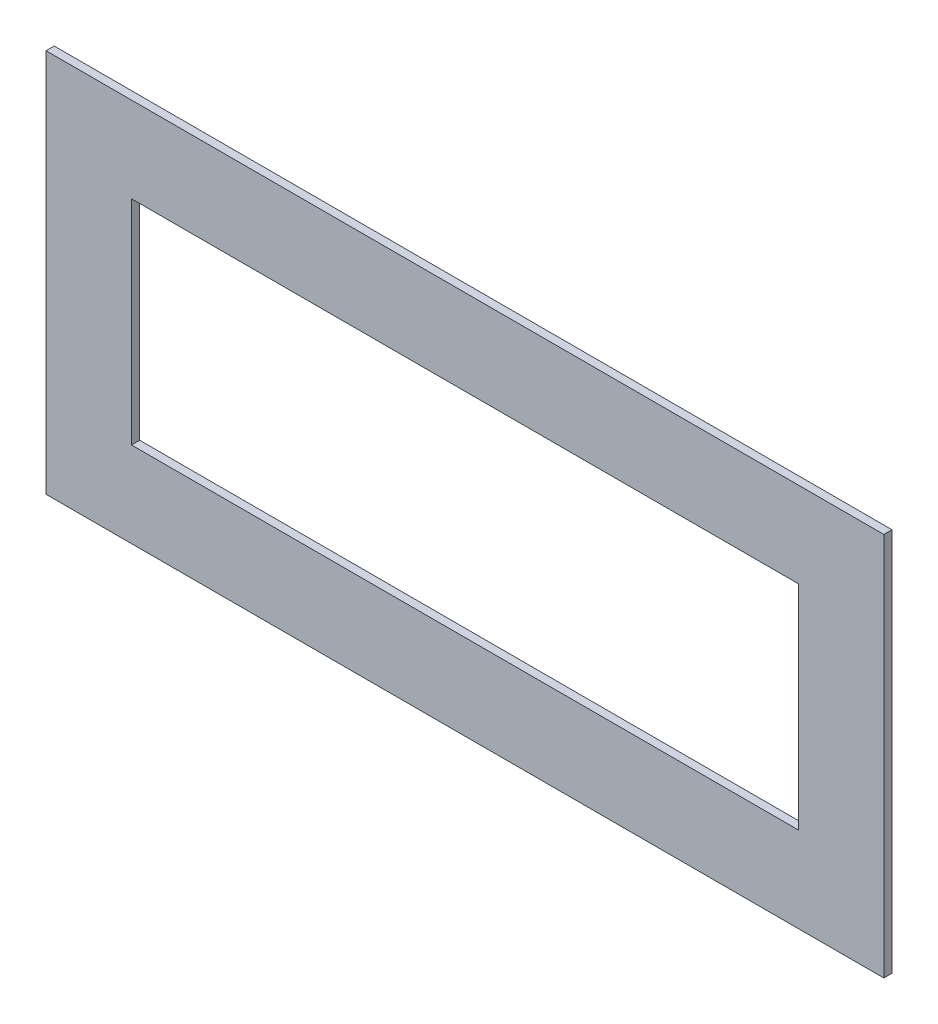
ISO-10303-21;
HEADER;
FILE_DESCRIPTION(('STEP AP214'),'2;1');
FILE_NAME('part.step','',(''),(''),'','','');
FILE_SCHEMA(('AUTOMOTIVE_DESIGN { 1 0 10303 214 1 1 1 1 }'));
ENDSEC;
DATA;
#1=APPLICATION_CONTEXT('core data for automotive mechanical design processes');
#2=APPLICATION_PROTOCOL_DEFINITION('international standard','automotive_design',2000,#1);
#3=PRODUCT_CONTEXT('',#1,'mechanical');
#4=PRODUCT('Part','Part','',(#3));
#5=PRODUCT_RELATED_PRODUCT_CATEGORY('part','',(#4));
#6=PRODUCT_DEFINITION_FORMATION('','',#4);
#7=PRODUCT_DEFINITION_CONTEXT('part definition',#1,'design');
#8=PRODUCT_DEFINITION('design','',#6,#7);
#9=PRODUCT_DEFINITION_SHAPE('','',#8);
#10=(LENGTH_UNIT() NAMED_UNIT(*) SI_UNIT(.MILLI.,.METRE.));
#11=(NAMED_UNIT(*) PLANE_ANGLE_UNIT() SI_UNIT($,.RADIAN.));
#12=(NAMED_UNIT(*) SI_UNIT($,.STERADIAN.) SOLID_ANGLE_UNIT());
#13=UNCERTAINTY_MEASURE_WITH_UNIT(LENGTH_MEASURE(1.E-05),#10,'distance_accuracy_value','');
#14=(GEOMETRIC_REPRESENTATION_CONTEXT(3) GLOBAL_UNCERTAINTY_ASSIGNED_CONTEXT((#13)) GLOBAL_UNIT_ASSIGNED_CONTEXT((#10,
#11,#12)) REPRESENTATION_CONTEXT('',''));
#15=CARTESIAN_POINT('',(0.,0.,0.));
#16=DIRECTION('',(0.,0.,1.));
#17=DIRECTION('',(1.,0.,0.));
#18=AXIS2_PLACEMENT_3D('',#15,#16,#17);
#19=CARTESIAN_POINT('',(0.,0.,1.8288));
#20=DIRECTION('',(0.,0.,-1.));
#21=DIRECTION('',(-1.,0.,0.));
#22=AXIS2_PLACEMENT_3D('',#19,#20,#21);
#23=PLANE('',#22);
#24=DIRECTION('',(0.,-1.,0.));
#25=VECTOR('',#24,1.);
#26=CARTESIAN_POINT('',(-66.3946490068451,-43.5481756828605,1.8288));
#27=LINE('',#26,#25);
#28=CARTESIAN_POINT('',(-66.3946490068451,42.5324243171395,1.8288));
#29=VERTEX_POINT('',#28);
#30=CARTESIAN_POINT('',(-66.3946490068451,-43.5481756828605,1.8288));
#31=VERTEX_POINT('',#30);
#32=EDGE_CURVE('E133',#29,#31,#27,.T.);
#33=ORIENTED_EDGE('',*,*,#32,.T.);
#34=DIRECTION('',(1.,0.,0.));
#35=VECTOR('',#34,1.);
#36=CARTESIAN_POINT('',(-66.3946490068451,-43.5481756828605,1.8288));
#37=LINE('',#36,#35);
#38=CARTESIAN_POINT('',(121.336750993155,-43.5481756828605,1.8288));
#39=VERTEX_POINT('',#38);
#40=EDGE_CURVE('E136',#31,#39,#37,.T.);
#41=ORIENTED_EDGE('',*,*,#40,.T.);
#42=DIRECTION('',(0.,1.,0.));
#43=VECTOR('',#42,1.);
#44=CARTESIAN_POINT('',(121.336750993155,-43.5481756828605,1.8288));
#45=LINE('',#44,#43);
#46=CARTESIAN_POINT('',(121.336750993155,42.5324243171395,1.8288));
#47=VERTEX_POINT('',#46);
#48=EDGE_CURVE('E139',#39,#47,#45,.T.);
#49=ORIENTED_EDGE('',*,*,#48,.T.);
#50=DIRECTION('',(-1.,0.,0.));
#51=VECTOR('',#50,1.);
#52=CARTESIAN_POINT('',(-66.3946490068451,42.5324243171395,1.8288));
#53=LINE('',#52,#51);
#54=EDGE_CURVE('E141',#47,#29,#53,.T.);
#55=ORIENTED_EDGE('',*,*,#54,.T.);
#56=EDGE_LOOP('',(#33,#41,#49,#55));
#57=FACE_BOUND('',#56,.T.);
#58=DIRECTION('',(0.,-1.,0.));
#59=VECTOR('',#58,1.);
#60=CARTESIAN_POINT('',(-47.2430490068451,-24.3965756828605,1.8288));
#61=LINE('',#60,#59);
#62=CARTESIAN_POINT('',(-47.2430490068451,23.3808243171395,1.8288));
#63=VERTEX_POINT('',#62);
#64=CARTESIAN_POINT('',(-47.2430490068451,-24.3965756828605,1.8288));
#65=VERTEX_POINT('',#64);
#66=EDGE_CURVE('E97',#63,#65,#61,.T.);
#67=ORIENTED_EDGE('',*,*,#66,.F.);
#68=DIRECTION('',(-1.,0.,0.));
#69=VECTOR('',#68,1.);
#70=CARTESIAN_POINT('',(-47.2430490068451,23.3808243171395,1.8288));
#71=LINE('',#70,#69);
#72=CARTESIAN_POINT('',(102.185150993155,23.3808243171395,1.8288));
#73=VERTEX_POINT('',#72);
#74=EDGE_CURVE('E119',#73,#63,#71,.T.);
#75=ORIENTED_EDGE('',*,*,#74,.F.);
#76=DIRECTION('',(0.,1.,0.));
#77=VECTOR('',#76,1.);
#78=CARTESIAN_POINT('',(102.185150993155,-24.3965756828605,1.8288));
#79=LINE('',#78,#77);
#80=CARTESIAN_POINT('',(102.185150993155,-24.3965756828605,1.8288));
#81=VERTEX_POINT('',#80);
#82=EDGE_CURVE('E117',#81,#73,#79,.T.);
#83=ORIENTED_EDGE('',*,*,#82,.F.);
#84=DIRECTION('',(1.,0.,0.));
#85=VECTOR('',#84,1.);
#86=CARTESIAN_POINT('',(-47.2430490068451,-24.3965756828605,1.8288));
#87=LINE('',#86,#85);
#88=EDGE_CURVE('E105',#65,#81,#87,.T.);
#89=ORIENTED_EDGE('',*,*,#88,.F.);
#90=EDGE_LOOP('',(#67,#75,#83,#89));
#91=FACE_BOUND('',#90,.T.);
#92=ADVANCED_FACE('F32',(#57,#91),#23,.F.);
#93=CARTESIAN_POINT('',(0.,0.,0.));
#94=DIRECTION('',(0.,0.,-1.));
#95=DIRECTION('',(-1.,0.,0.));
#96=AXIS2_PLACEMENT_3D('',#93,#94,#95);
#97=PLANE('',#96);
#98=DIRECTION('',(0.,-1.,0.));
#99=VECTOR('',#98,1.);
#100=CARTESIAN_POINT('',(-66.3946490068451,-43.5481756828605,0.));
#101=LINE('',#100,#99);
#102=CARTESIAN_POINT('',(-66.3946490068451,42.5324243171395,0.));
#103=VERTEX_POINT('',#102);
#104=CARTESIAN_POINT('',(-66.3946490068451,-43.5481756828605,0.));
#105=VERTEX_POINT('',#104);
#106=EDGE_CURVE('E113',#103,#105,#101,.T.);
#107=ORIENTED_EDGE('',*,*,#106,.F.);
#108=DIRECTION('',(-1.,0.,0.));
#109=VECTOR('',#108,1.);
#110=CARTESIAN_POINT('',(-66.3946490068451,42.5324243171395,0.));
#111=LINE('',#110,#109);
#112=CARTESIAN_POINT('',(121.336750993155,42.5324243171395,0.));
#113=VERTEX_POINT('',#112);
#114=EDGE_CURVE('E137',#113,#103,#111,.T.);
#115=ORIENTED_EDGE('',*,*,#114,.F.);
#116=DIRECTION('',(0.,1.,0.));
#117=VECTOR('',#116,1.);
#118=CARTESIAN_POINT('',(121.336750993155,-43.5481756828605,0.));
#119=LINE('',#118,#117);
#120=CARTESIAN_POINT('',(121.336750993155,-43.5481756828605,0.));
#121=VERTEX_POINT('',#120);
#122=EDGE_CURVE('E148',#121,#113,#119,.T.);
#123=ORIENTED_EDGE('',*,*,#122,.F.);
#124=DIRECTION('',(1.,0.,0.));
#125=VECTOR('',#124,1.);
#126=CARTESIAN_POINT('',(-66.3946490068451,-43.5481756828605,0.));
#127=LINE('',#126,#125);
#128=EDGE_CURVE('E146',#105,#121,#127,.T.);
#129=ORIENTED_EDGE('',*,*,#128,.F.);
#130=EDGE_LOOP('',(#107,#115,#123,#129));
#131=FACE_BOUND('',#130,.T.);
#132=DIRECTION('',(-1.,0.,0.));
#133=VECTOR('',#132,1.);
#134=CARTESIAN_POINT('',(-47.2430490068451,23.3808243171395,0.));
#135=LINE('',#134,#133);
#136=CARTESIAN_POINT('',(102.185150993155,23.3808243171395,0.));
#137=VERTEX_POINT('',#136);
#138=CARTESIAN_POINT('',(-47.2430490068451,23.3808243171395,0.));
#139=VERTEX_POINT('',#138);
#140=EDGE_CURVE('E106',#137,#139,#135,.T.);
#141=ORIENTED_EDGE('',*,*,#140,.T.);
#142=DIRECTION('',(0.,-1.,0.));
#143=VECTOR('',#142,1.);
#144=CARTESIAN_POINT('',(-47.2430490068451,-24.3965756828605,0.));
#145=LINE('',#144,#143);
#146=CARTESIAN_POINT('',(-47.2430490068451,-24.3965756828605,0.));
#147=VERTEX_POINT('',#146);
#148=EDGE_CURVE('E55',#139,#147,#145,.T.);
#149=ORIENTED_EDGE('',*,*,#148,.T.);
#150=DIRECTION('',(1.,0.,0.));
#151=VECTOR('',#150,1.);
#152=CARTESIAN_POINT('',(-47.2430490068451,-24.3965756828605,0.));
#153=LINE('',#152,#151);
#154=CARTESIAN_POINT('',(102.185150993155,-24.3965756828605,0.));
#155=VERTEX_POINT('',#154);
#156=EDGE_CURVE('E112',#147,#155,#153,.T.);
#157=ORIENTED_EDGE('',*,*,#156,.T.);
#158=DIRECTION('',(0.,1.,0.));
#159=VECTOR('',#158,1.);
#160=CARTESIAN_POINT('',(102.185150993155,-24.3965756828605,0.));
#161=LINE('',#160,#159);
#162=EDGE_CURVE('E125',#155,#137,#161,.T.);
#163=ORIENTED_EDGE('',*,*,#162,.T.);
#164=EDGE_LOOP('',(#141,#149,#157,#163));
#165=FACE_BOUND('',#164,.T.);
#166=ADVANCED_FACE('F166',(#131,#165),#97,.T.);
#167=CARTESIAN_POINT('',(-66.3946490068451,-43.5481756828605,1.8288));
#168=DIRECTION('',(1.,0.,0.));
#169=DIRECTION('',(0.,0.,-1.));
#170=AXIS2_PLACEMENT_3D('',#167,#168,#169);
#171=PLANE('',#170);
#172=ORIENTED_EDGE('',*,*,#106,.T.);
#173=DIRECTION('',(0.,0.,-1.));
#174=VECTOR('',#173,1.);
#175=CARTESIAN_POINT('',(-66.3946490068451,-43.5481756828605,1.8288));
#176=LINE('',#175,#174);
#177=EDGE_CURVE('E11',#31,#105,#176,.T.);
#178=ORIENTED_EDGE('',*,*,#177,.F.);
#179=ORIENTED_EDGE('',*,*,#32,.F.);
#180=DIRECTION('',(0.,0.,-1.));
#181=VECTOR('',#180,1.);
#182=CARTESIAN_POINT('',(-66.3946490068451,42.5324243171395,1.8288));
#183=LINE('',#182,#181);
#184=EDGE_CURVE('E143',#29,#103,#183,.T.);
#185=ORIENTED_EDGE('',*,*,#184,.T.);
#186=EDGE_LOOP('',(#172,#178,#179,#185));
#187=FACE_BOUND('',#186,.T.);
#188=ADVANCED_FACE('F34',(#187),#171,.F.);
#189=CARTESIAN_POINT('',(-66.3946490068451,-43.5481756828605,1.8288));
#190=DIRECTION('',(0.,1.,0.));
#191=DIRECTION('',(0.,0.,1.));
#192=AXIS2_PLACEMENT_3D('',#189,#190,#191);
#193=PLANE('',#192);
#194=ORIENTED_EDGE('',*,*,#128,.T.);
#195=DIRECTION('',(0.,0.,-1.));
#196=VECTOR('',#195,1.);
#197=CARTESIAN_POINT('',(121.336750993155,-43.5481756828605,1.8288));
#198=LINE('',#197,#196);
#199=EDGE_CURVE('E40',#39,#121,#198,.T.);
#200=ORIENTED_EDGE('',*,*,#199,.F.);
#201=ORIENTED_EDGE('',*,*,#40,.F.);
#202=ORIENTED_EDGE('',*,*,#177,.T.);
#203=EDGE_LOOP('',(#194,#200,#201,#202));
#204=FACE_BOUND('',#203,.T.);
#205=ADVANCED_FACE('F176',(#204),#193,.F.);
#206=CARTESIAN_POINT('',(121.336750993155,-43.5481756828605,1.8288));
#207=DIRECTION('',(-1.,0.,0.));
#208=DIRECTION('',(0.,0.,1.));
#209=AXIS2_PLACEMENT_3D('',#206,#207,#208);
#210=PLANE('',#209);
#211=ORIENTED_EDGE('',*,*,#122,.T.);
#212=DIRECTION('',(0.,0.,-1.));
#213=VECTOR('',#212,1.);
#214=CARTESIAN_POINT('',(121.336750993155,42.5324243171395,1.8288));
#215=LINE('',#214,#213);
#216=EDGE_CURVE('E153',#47,#113,#215,.T.);
#217=ORIENTED_EDGE('',*,*,#216,.F.);
#218=ORIENTED_EDGE('',*,*,#48,.F.);
#219=ORIENTED_EDGE('',*,*,#199,.T.);
#220=EDGE_LOOP('',(#211,#217,#218,#219));
#221=FACE_BOUND('',#220,.T.);
#222=ADVANCED_FACE('F160',(#221),#210,.F.);
#223=CARTESIAN_POINT('',(-66.3946490068451,42.5324243171395,1.8288));
#224=DIRECTION('',(0.,-1.,0.));
#225=DIRECTION('',(0.,0.,-1.));
#226=AXIS2_PLACEMENT_3D('',#223,#224,#225);
#227=PLANE('',#226);
#228=ORIENTED_EDGE('',*,*,#114,.T.);
#229=ORIENTED_EDGE('',*,*,#184,.F.);
#230=ORIENTED_EDGE('',*,*,#54,.F.);
#231=ORIENTED_EDGE('',*,*,#216,.T.);
#232=EDGE_LOOP('',(#228,#229,#230,#231));
#233=FACE_BOUND('',#232,.T.);
#234=ADVANCED_FACE('F170',(#233),#227,.F.);
#235=CARTESIAN_POINT('',(-47.2430490068451,-24.3965756828605,1.8288));
#236=DIRECTION('',(1.,0.,0.));
#237=DIRECTION('',(0.,0.,-1.));
#238=AXIS2_PLACEMENT_3D('',#235,#236,#237);
#239=PLANE('',#238);
#240=ORIENTED_EDGE('',*,*,#148,.F.);
#241=DIRECTION('',(0.,0.,-1.));
#242=VECTOR('',#241,1.);
#243=CARTESIAN_POINT('',(-47.2430490068451,23.3808243171395,1.8288));
#244=LINE('',#243,#242);
#245=EDGE_CURVE('E101',#63,#139,#244,.T.);
#246=ORIENTED_EDGE('',*,*,#245,.F.);
#247=ORIENTED_EDGE('',*,*,#66,.T.);
#248=DIRECTION('',(0.,0.,-1.));
#249=VECTOR('',#248,1.);
#250=CARTESIAN_POINT('',(-47.2430490068451,-24.3965756828605,1.8288));
#251=LINE('',#250,#249);
#252=EDGE_CURVE('E100',#65,#147,#251,.T.);
#253=ORIENTED_EDGE('',*,*,#252,.T.);
#254=EDGE_LOOP('',(#240,#246,#247,#253));
#255=FACE_BOUND('',#254,.T.);
#256=ADVANCED_FACE('F99',(#255),#239,.T.);
#257=CARTESIAN_POINT('',(-47.2430490068451,-24.3965756828605,1.8288));
#258=DIRECTION('',(0.,1.,0.));
#259=DIRECTION('',(0.,0.,1.));
#260=AXIS2_PLACEMENT_3D('',#257,#258,#259);
#261=PLANE('',#260);
#262=ORIENTED_EDGE('',*,*,#156,.F.);
#263=ORIENTED_EDGE('',*,*,#252,.F.);
#264=ORIENTED_EDGE('',*,*,#88,.T.);
#265=DIRECTION('',(0.,0.,-1.));
#266=VECTOR('',#265,1.);
#267=CARTESIAN_POINT('',(102.185150993155,-24.3965756828605,1.8288));
#268=LINE('',#267,#266);
#269=EDGE_CURVE('E114',#81,#155,#268,.T.);
#270=ORIENTED_EDGE('',*,*,#269,.T.);
#271=EDGE_LOOP('',(#262,#263,#264,#270));
#272=FACE_BOUND('',#271,.T.);
#273=ADVANCED_FACE('F109',(#272),#261,.T.);
#274=CARTESIAN_POINT('',(102.185150993155,-24.3965756828605,1.8288));
#275=DIRECTION('',(-1.,0.,0.));
#276=DIRECTION('',(0.,0.,1.));
#277=AXIS2_PLACEMENT_3D('',#274,#275,#276);
#278=PLANE('',#277);
#279=ORIENTED_EDGE('',*,*,#162,.F.);
#280=ORIENTED_EDGE('',*,*,#269,.F.);
#281=ORIENTED_EDGE('',*,*,#82,.T.);
#282=DIRECTION('',(0.,0.,-1.));
#283=VECTOR('',#282,1.);
#284=CARTESIAN_POINT('',(102.185150993155,23.3808243171395,1.8288));
#285=LINE('',#284,#283);
#286=EDGE_CURVE('E47',#73,#137,#285,.T.);
#287=ORIENTED_EDGE('',*,*,#286,.T.);
#288=EDGE_LOOP('',(#279,#280,#281,#287));
#289=FACE_BOUND('',#288,.T.);
#290=ADVANCED_FACE('F199',(#289),#278,.T.);
#291=CARTESIAN_POINT('',(-47.2430490068451,23.3808243171395,1.8288));
#292=DIRECTION('',(0.,-1.,0.));
#293=DIRECTION('',(0.,0.,-1.));
#294=AXIS2_PLACEMENT_3D('',#291,#292,#293);
#295=PLANE('',#294);
#296=ORIENTED_EDGE('',*,*,#140,.F.);
#297=ORIENTED_EDGE('',*,*,#286,.F.);
#298=ORIENTED_EDGE('',*,*,#74,.T.);
#299=ORIENTED_EDGE('',*,*,#245,.T.);
#300=EDGE_LOOP('',(#296,#297,#298,#299));
#301=FACE_BOUND('',#300,.T.);
#302=ADVANCED_FACE('F203',(#301),#295,.T.);
#303=CLOSED_SHELL('',(#92,#166,#188,#205,#222,#234,#256,#273,#290,#302));
#304=MANIFOLD_SOLID_BREP('B2',#303);
#305=ADVANCED_BREP_SHAPE_REPRESENTATION('',(#18,#304),#14);
#306=SHAPE_DEFINITION_REPRESENTATION(#9,#305);
ENDSEC;
END-ISO-10303-21;
